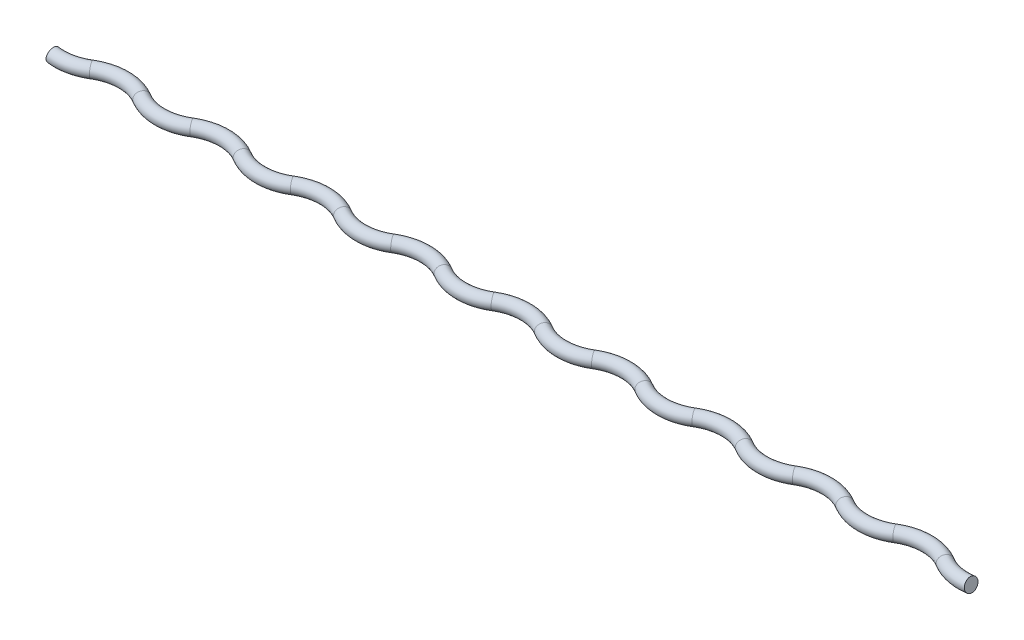
ISO-10303-21;
HEADER;
FILE_DESCRIPTION(('STEP AP214'),'2;1');
FILE_NAME('part.step','',(''),(''),'','','');
FILE_SCHEMA(('AUTOMOTIVE_DESIGN { 1 0 10303 214 1 1 1 1 }'));
ENDSEC;
DATA;
#1=APPLICATION_CONTEXT('core data for automotive mechanical design processes');
#2=APPLICATION_PROTOCOL_DEFINITION('international standard','automotive_design',2000,#1);
#3=PRODUCT_CONTEXT('',#1,'mechanical');
#4=PRODUCT('Part','Part','',(#3));
#5=PRODUCT_RELATED_PRODUCT_CATEGORY('part','',(#4));
#6=PRODUCT_DEFINITION_FORMATION('','',#4);
#7=PRODUCT_DEFINITION_CONTEXT('part definition',#1,'design');
#8=PRODUCT_DEFINITION('design','',#6,#7);
#9=PRODUCT_DEFINITION_SHAPE('','',#8);
#10=(LENGTH_UNIT() NAMED_UNIT(*) SI_UNIT(.MILLI.,.METRE.));
#11=(NAMED_UNIT(*) PLANE_ANGLE_UNIT() SI_UNIT($,.RADIAN.));
#12=(NAMED_UNIT(*) SI_UNIT($,.STERADIAN.) SOLID_ANGLE_UNIT());
#13=UNCERTAINTY_MEASURE_WITH_UNIT(LENGTH_MEASURE(1.E-05),#10,'distance_accuracy_value','');
#14=(GEOMETRIC_REPRESENTATION_CONTEXT(3) GLOBAL_UNCERTAINTY_ASSIGNED_CONTEXT((#13)) GLOBAL_UNIT_ASSIGNED_CONTEXT((#10,
#11,#12)) REPRESENTATION_CONTEXT('',''));
#15=CARTESIAN_POINT('',(0.,0.,0.));
#16=DIRECTION('',(0.,0.,1.));
#17=DIRECTION('',(1.,0.,0.));
#18=AXIS2_PLACEMENT_3D('',#15,#16,#17);
#19=CARTESIAN_POINT('',(0.,0.,29.778888860546));
#20=DIRECTION('',(0.,0.,-1.));
#21=DIRECTION('',(-1.,0.,0.));
#22=AXIS2_PLACEMENT_3D('',#19,#20,#21);
#23=CYLINDRICAL_SURFACE('',#22,6.9);
#24=CARTESIAN_POINT('',(-6.861066734108,0.731958516664,0.551673406014));
#25=CARTESIAN_POINT('',(-6.861647917028,0.726510756017,0.552583724596));
#26=CARTESIAN_POINT('',(-6.862206206041,0.721216169601,0.553941376582));
#27=CARTESIAN_POINT('',(-6.863280247994,0.710922650518,0.557519617921));
#28=CARTESIAN_POINT('',(-6.863795993767,0.705923697934,0.559740152154));
#29=CARTESIAN_POINT('',(-6.864785543563,0.696234985269,0.565083777531));
#30=CARTESIAN_POINT('',(-6.865245082189,0.691685160617,0.568129724994));
#31=CARTESIAN_POINT('',(-6.866099773349,0.683148814216,0.574936352947));
#32=CARTESIAN_POINT('',(-6.866494908518,0.679162315691,0.578697064755));
#33=CARTESIAN_POINT('',(-6.867221874932,0.671771921038,0.586961668663));
#34=CARTESIAN_POINT('',(-6.867543389303,0.668473191246,0.59134851969));
#35=CARTESIAN_POINT('',(-6.868109496233,0.662631541,0.600604225865));
#36=CARTESIAN_POINT('',(-6.868354065815,0.660088708046,0.605473137678));
#37=CARTESIAN_POINT('',(-6.868769498121,0.655751780074,0.615784396645));
#38=CARTESIAN_POINT('',(-6.868933396042,0.65403031842,0.621088704832));
#39=CARTESIAN_POINT('',(-6.869176918725,0.651467662999,0.631907940249));
#40=CARTESIAN_POINT('',(-6.869256524696,0.650626581189,0.637422894449));
#41=CARTESIAN_POINT('',(-6.869330270421,0.649847514319,0.648777518252));
#42=CARTESIAN_POINT('',(-6.869321734534,0.649937854185,0.654460624658));
#43=CARTESIAN_POINT('',(-6.869217301147,0.651040687253,0.665735951735));
#44=CARTESIAN_POINT('',(-6.869121399028,0.652053257394,0.671328164849));
#45=CARTESIAN_POINT('',(-6.868835581417,0.655057297939,0.682495482437));
#46=CARTESIAN_POINT('',(-6.868648451173,0.657019199895,0.68790973424));
#47=CARTESIAN_POINT('',(-6.868189141701,0.661803361016,0.698339861372));
#48=CARTESIAN_POINT('',(-6.867916974648,0.664625633242,0.703355731248));
#49=CARTESIAN_POINT('',(-6.86727905821,0.67118495934,0.712995847321));
#50=CARTESIAN_POINT('',(-6.86692201009,0.674831976241,0.717478969508));
#51=CARTESIAN_POINT('',(-6.866132787576,0.682815225514,0.725774687425));
#52=CARTESIAN_POINT('',(-6.865700634754,0.687151425751,0.729587316142));
#53=CARTESIAN_POINT('',(-6.864755344841,0.696531555511,0.736499208198));
#54=CARTESIAN_POINT('',(-6.864256143939,0.701437152703,0.739500230792));
#55=CARTESIAN_POINT('',(-6.8632020994,0.711676493628,0.744637112543));
#56=CARTESIAN_POINT('',(-6.862647274256,0.717010200682,0.746773048637));
#57=CARTESIAN_POINT('',(-6.861481674352,0.728079624993,0.750121839693));
#58=CARTESIAN_POINT('',(-6.860888374974,0.733650290574,0.751293533665));
#59=CARTESIAN_POINT('',(-6.859675395439,0.744906377951,0.752682766346));
#60=CARTESIAN_POINT('',(-6.85905572084,0.750591788529,0.752900400932));
#61=CARTESIAN_POINT('',(-6.85779560467,0.762018444841,0.752336069034));
#62=CARTESIAN_POINT('',(-6.857173848979,0.767591755806,0.751573441735));
#63=CARTESIAN_POINT('',(-6.855940440293,0.778531295366,0.74912028844));
#64=CARTESIAN_POINT('',(-6.855328778127,0.783897539994,0.747429838492));
#65=CARTESIAN_POINT('',(-6.854125063645,0.794353189118,0.74309952695));
#66=CARTESIAN_POINT('',(-6.853550399049,0.799292965267,0.740533517457));
#67=CARTESIAN_POINT('',(-6.852449511628,0.808676701297,0.734607515869));
#68=CARTESIAN_POINT('',(-6.851923272131,0.813120676199,0.731247550645));
#69=CARTESIAN_POINT('',(-6.850929050733,0.821455176748,0.723728273473));
#70=CARTESIAN_POINT('',(-6.850475022563,0.825229543083,0.719684469814));
#71=CARTESIAN_POINT('',(-6.849648783256,0.832059721152,0.711022416772));
#72=CARTESIAN_POINT('',(-6.84927655969,0.835115506406,0.706404147691));
#73=CARTESIAN_POINT('',(-6.848621034528,0.840474389223,0.696578474819));
#74=CARTESIAN_POINT('',(-6.84834697844,0.84270217194,0.691512780717));
#75=CARTESIAN_POINT('',(-6.847903139692,0.846301292153,0.681081291112));
#76=CARTESIAN_POINT('',(-6.84773335742,0.847672542883,0.675715465639));
#77=CARTESIAN_POINT('',(-6.847502511501,0.849535309639,0.66463196408));
#78=CARTESIAN_POINT('',(-6.847445533312,0.849993922568,0.659069013419));
#79=CARTESIAN_POINT('',(-6.847444039274,0.850005958269,0.647941875843));
#80=CARTESIAN_POINT('',(-6.847499537091,0.849559260774,0.642377688764));
#81=CARTESIAN_POINT('',(-6.847727903307,0.847716602485,0.631157432546));
#82=CARTESIAN_POINT('',(-6.847899415271,0.846331470087,0.625659452113));
#83=CARTESIAN_POINT('',(-6.848348041267,0.842693576932,0.614962764682));
#84=CARTESIAN_POINT('',(-6.84862517553,0.840440725828,0.609764089232));
#85=CARTESIAN_POINT('',(-6.84929252621,0.834984784054,0.599578298581));
#86=CARTESIAN_POINT('',(-6.849675331775,0.831841562128,0.594741472594));
#87=CARTESIAN_POINT('',(-6.850525388209,0.824811760773,0.585650467813));
#88=CARTESIAN_POINT('',(-6.850992656978,0.820925176351,0.581396294553));
#89=CARTESIAN_POINT('',(-6.852017814071,0.81232435543,0.573447890826));
#90=CARTESIAN_POINT('',(-6.852561919478,0.807724652831,0.569875545786));
#91=CARTESIAN_POINT('',(-6.853701385437,0.797998304718,0.563550838972));
#92=CARTESIAN_POINT('',(-6.854296756631,0.79287172223,0.560798382144));
#93=CARTESIAN_POINT('',(-6.855535382726,0.782089455512,0.556169982251));
#94=CARTESIAN_POINT('',(-6.856160150322,0.776595027906,0.55435792185));
#95=CARTESIAN_POINT('',(-6.857421232735,0.765379566661,0.551695559163));
#96=CARTESIAN_POINT('',(-6.858057551631,0.759658574767,0.550845082647));
#97=CARTESIAN_POINT('',(-6.859102247391,0.750153282753,0.550290937483));
#98=CARTESIAN_POINT('',(-6.859500829024,0.746499701917,0.550282367222));
#99=CARTESIAN_POINT('',(-6.860289865652,0.739213357285,0.550670985734));
#100=CARTESIAN_POINT('',(-6.86068032053,0.735580592625,0.551068158598));
#101=CARTESIAN_POINT('',(-6.861066734108,0.731958516664,0.551673406014));
#102=(BOUNDED_CURVE() B_SPLINE_CURVE(3,(#24,#25,#26,#27,#28,#29,#30,#31,#32,#33,#34,#35,#36,#37,
#38,#39,#40,#41,#42,#43,#44,#45,#46,#47,#48,#49,#50,#51,#52,#53,#54,#55,#56,#57,#58,#59,#60,#61,
#62,#63,#64,#65,#66,#67,#68,#69,#70,#71,#72,#73,#74,#75,#76,#77,#78,#79,#80,#81,#82,#83,#84,#85,
#86,#87,#88,#89,#90,#91,#92,#93,#94,#95,#96,#97,#98,#99,#100,#101),.UNSPECIFIED.,.T.,
.F.) B_SPLINE_CURVE_WITH_KNOTS((4,2,2,2,2,2,2,2,2,2,2,2,2,2,2,2,2,2,2,2,2,2,2,2,2,2,2,2,2,2,2,2,
2,2,2,2,2,2,4),(0.,0.01642578149364,0.03285156298728,0.04927819433326,0.06570482567923,
0.08213960966108,0.09857439364293,0.115252530148,0.131930666654,0.148925831361,0.165920996067,
0.1831531784,0.200385360734,0.217705013623,0.235024666513,0.252291542667,0.26955841882,
0.28667793049,0.30379744216,0.320724023683,0.337650605205,0.354385049828,0.371119494451,
0.387714073446,0.40430865244,0.420872912787,0.437437173133,0.454124735561,0.470812297989,
0.487771565946,0.504730833903,0.522019590374,0.539308346845,0.556806515515,0.574304684185,
0.591715233509,0.609125782833,0.620047173094,0.630968563355),
.UNSPECIFIED.) CURVE() GEOMETRIC_REPRESENTATION_ITEM() RATIONAL_B_SPLINE_CURVE((1.,1.,1.,1.,1.,
1.,1.,1.,1.,1.,1.,1.,1.,1.,1.,1.,1.,1.,1.,1.,1.,1.,1.,1.,1.,1.,1.,1.,1.,1.,1.,1.,1.,1.,1.,1.,1.,
1.,1.,1.,1.,1.,1.,1.,1.,1.,1.,1.,1.,1.,1.,1.,1.,1.,1.,1.,1.,1.,1.,1.,1.,1.,1.,1.,1.,1.,1.,1.,1.,
1.,1.,1.,1.,1.,1.,1.,1.,1.)) REPRESENTATION_ITEM(''));
#103=CARTESIAN_POINT('',(-6.861066734108,0.731958516664,0.551673406014));
#104=VERTEX_POINT('',#103);
#105=EDGE_CURVE('E234',#104,#104,#102,.T.);
#106=ORIENTED_EDGE('',*,*,#105,.T.);
#107=EDGE_LOOP('',(#106));
#108=FACE_BOUND('',#107,.T.);
#109=ADVANCED_FACE('F17',(#108),#23,.T.);
#110=CARTESIAN_POINT('',(0.,0.,29.778888860546));
#111=DIRECTION('',(0.,0.,-1.));
#112=DIRECTION('',(-1.,0.,0.));
#113=AXIS2_PLACEMENT_3D('',#110,#111,#112);
#114=CYLINDRICAL_SURFACE('',#113,6.9);
#115=CARTESIAN_POINT('',(6.861066734108,0.731958516664,0.551673406014));
#116=CARTESIAN_POINT('',(6.860471069137,0.737542025869,0.550740403903));
#117=CARTESIAN_POINT('',(6.859868899691,0.743121891426,0.550304532315));
#118=CARTESIAN_POINT('',(6.858651560031,0.754274647962,0.550374209384));
#119=CARTESIAN_POINT('',(6.858036389714,0.759847538081,0.550879901817));
#120=CARTESIAN_POINT('',(6.85679389506,0.770979120922,0.552860545468));
#121=CARTESIAN_POINT('',(6.856184237104,0.776379806572,0.55430602518));
#122=CARTESIAN_POINT('',(6.854987604711,0.786875362702,0.55806012224));
#123=CARTESIAN_POINT('',(6.854400625323,0.791970185333,0.560368871924));
#124=CARTESIAN_POINT('',(6.853241598365,0.801938430694,0.565928300166));
#125=CARTESIAN_POINT('',(6.852686357148,0.806665770826,0.569117640083));
#126=CARTESIAN_POINT('',(6.851635596953,0.815542532202,0.576226947124));
#127=CARTESIAN_POINT('',(6.851140066258,0.819691907197,0.58014697028));
#128=CARTESIAN_POINT('',(6.850205887254,0.827462932981,0.588827806254));
#129=CARTESIAN_POINT('',(6.849781886072,0.83096198654,0.593478738175));
#130=CARTESIAN_POINT('',(6.84902856394,0.837148397942,0.603299057003));
#131=CARTESIAN_POINT('',(6.848699222154,0.839835790482,0.608468420463));
#132=CARTESIAN_POINT('',(6.84814280997,0.844360856896,0.619358018219));
#133=CARTESIAN_POINT('',(6.847924010168,0.846131462726,0.624920023987));
#134=CARTESIAN_POINT('',(6.847603635276,0.848720304573,0.636264397105));
#135=CARTESIAN_POINT('',(6.847502037358,0.849538668629,0.642046734629));
#136=CARTESIAN_POINT('',(6.847424278343,0.850165190141,0.653757492208));
#137=CARTESIAN_POINT('',(6.847447470769,0.849978580406,0.659510242878));
#138=CARTESIAN_POINT('',(6.847612982336,0.848644151705,0.670901152476));
#139=CARTESIAN_POINT('',(6.847755290197,0.847496468794,0.676539327543));
#140=CARTESIAN_POINT('',(6.848159970893,0.844220162951,0.687584825448));
#141=CARTESIAN_POINT('',(6.8484139942,0.842159145607,0.692832622565));
#142=CARTESIAN_POINT('',(6.849023059738,0.837191369794,0.702904835603));
#143=CARTESIAN_POINT('',(6.849378107435,0.83428468224,0.707729286182));
#144=CARTESIAN_POINT('',(6.850185096268,0.827632292251,0.716868036319));
#145=CARTESIAN_POINT('',(6.850623846832,0.823995628332,0.721056101067));
#146=CARTESIAN_POINT('',(6.85157123077,0.816080606307,0.728764782833));
#147=CARTESIAN_POINT('',(6.85207987956,0.81180225443,0.732285404356));
#148=CARTESIAN_POINT('',(6.853164126792,0.802597549463,0.738615843061));
#149=CARTESIAN_POINT('',(6.853723807772,0.797806441414,0.741338022636));
#150=CARTESIAN_POINT('',(6.854876297642,0.787842684297,0.745950061961));
#151=CARTESIAN_POINT('',(6.855469120603,0.782670016475,0.747839877693));
#152=CARTESIAN_POINT('',(6.856689434786,0.77190637353,0.750760723469));
#153=CARTESIAN_POINT('',(6.85729963676,0.766467304921,0.751746665133));
#154=CARTESIAN_POINT('',(6.858516559959,0.755500519252,0.752807933139));
#155=CARTESIAN_POINT('',(6.859123284995,0.749972794998,0.752883180904));
#156=CARTESIAN_POINT('',(6.860338675541,0.738772823373,0.752085511118));
#157=CARTESIAN_POINT('',(6.860930028439,0.733258962196,0.751215089619));
#158=CARTESIAN_POINT('',(6.862077077842,0.722445664766,0.748578654761));
#159=CARTESIAN_POINT('',(6.86263276487,0.717146247832,0.746812557979));
#160=CARTESIAN_POINT('',(6.863715325338,0.706710525173,0.742325964691));
#161=CARTESIAN_POINT('',(6.864226426469,0.701725172544,0.739658676344));
#162=CARTESIAN_POINT('',(6.865187943557,0.692255120068,0.733539525138));
#163=CARTESIAN_POINT('',(6.865638340531,0.687770456243,0.730087603532));
#164=CARTESIAN_POINT('',(6.866484005678,0.679275947811,0.722327418993));
#165=CARTESIAN_POINT('',(6.866866605782,0.675392833376,0.718121110174));
#166=CARTESIAN_POINT('',(6.867554066669,0.668366368365,0.709124695226));
#167=CARTESIAN_POINT('',(6.867858908351,0.665223039198,0.704334570911));
#168=CARTESIAN_POINT('',(6.868392949771,0.659686350412,0.69410777238));
#169=CARTESIAN_POINT('',(6.86861393279,0.657378218285,0.68881324822));
#170=CARTESIAN_POINT('',(6.868968361655,0.653664383439,0.67791390036));
#171=CARTESIAN_POINT('',(6.869101799839,0.65225864714,0.672309087852));
#172=CARTESIAN_POINT('',(6.869278968912,0.650390136232,0.660765822077));
#173=CARTESIAN_POINT('',(6.869320006473,0.649955883907,0.654993966915));
#174=CARTESIAN_POINT('',(6.869310994652,0.650051121913,0.643458453665));
#175=CARTESIAN_POINT('',(6.869260956463,0.650580506682,0.637694794679));
#176=CARTESIAN_POINT('',(6.869065039094,0.652645812819,0.626217075304));
#177=CARTESIAN_POINT('',(6.868922686476,0.654144458578,0.620670819424));
#178=CARTESIAN_POINT('',(6.868549762179,0.658048637985,0.609910705477));
#179=CARTESIAN_POINT('',(6.86831921629,0.660454039613,0.604696798572));
#180=CARTESIAN_POINT('',(6.867766566228,0.666176043514,0.594700461405));
#181=CARTESIAN_POINT('',(6.867454061655,0.669393515004,0.590059580325));
#182=CARTESIAN_POINT('',(6.866751639204,0.676561078069,0.581390096409));
#183=CARTESIAN_POINT('',(6.866361746667,0.680511094083,0.577361429015));
#184=CARTESIAN_POINT('',(6.865505147614,0.689098925154,0.570020464184));
#185=CARTESIAN_POINT('',(6.865052540755,0.693596604293,0.566803338246));
#186=CARTESIAN_POINT('',(6.8640894899,0.70306337656,0.561171462912));
#187=CARTESIAN_POINT('',(6.863579059817,0.708032470671,0.558756712788));
#188=CARTESIAN_POINT('',(6.862721711133,0.716282084044,0.555599265371));
#189=CARTESIAN_POINT('',(6.862399898943,0.719359062121,0.554596079849));
#190=CARTESIAN_POINT('',(6.861743218375,0.725596195107,0.55290068775));
#191=CARTESIAN_POINT('',(6.861408350383,0.728756351507,0.552208486506));
#192=CARTESIAN_POINT('',(6.861066734108,0.731958516664,0.551673406014));
#193=(BOUNDED_CURVE() B_SPLINE_CURVE(3,(#115,#116,#117,#118,#119,#120,#121,#122,#123,#124,#125,
#126,#127,#128,#129,#130,#131,#132,#133,#134,#135,#136,#137,#138,#139,#140,#141,#142,#143,#144,
#145,#146,#147,#148,#149,#150,#151,#152,#153,#154,#155,#156,#157,#158,#159,#160,#161,#162,#163,
#164,#165,#166,#167,#168,#169,#170,#171,#172,#173,#174,#175,#176,#177,#178,#179,#180,#181,#182,
#183,#184,#185,#186,#187,#188,#189,#190,#191,#192),.UNSPECIFIED.,.T.,
.F.) B_SPLINE_CURVE_WITH_KNOTS((4,2,2,2,2,2,2,2,2,2,2,2,2,2,2,2,2,2,2,2,2,2,2,2,2,2,2,2,2,2,2,2,
2,2,2,2,2,2,4),(0.,0.01682881908812,0.03365763817624,0.05046513141056,0.06727262464488,
0.08439863161922,0.101524638594,0.118974053753,0.136423468913,0.153892868785,0.171362268658,
0.188575137479,0.205788006301,0.222661296672,0.239534587042,0.256165156459,0.272795725875,
0.289348644588,0.3059015633,0.322521304498,0.339141045697,0.355917530555,0.372694015414,
0.389662845368,0.406631675322,0.423783133396,0.440934591469,0.458215689179,0.475496786889,
0.492804741559,0.510112696229,0.527297515286,0.544482334343,0.561392563542,0.578302792741,
0.594887135616,0.611471478491,0.621121960601,0.630772442711),
.UNSPECIFIED.) CURVE() GEOMETRIC_REPRESENTATION_ITEM() RATIONAL_B_SPLINE_CURVE((1.,1.,1.,1.,1.,
1.,1.,1.,1.,1.,1.,1.,1.,1.,1.,1.,1.,1.,1.,1.,1.,1.,1.,1.,1.,1.,1.,1.,1.,1.,1.,1.,1.,1.,1.,1.,1.,
1.,1.,1.,1.,1.,1.,1.,1.,1.,1.,1.,1.,1.,1.,1.,1.,1.,1.,1.,1.,1.,1.,1.,1.,1.,1.,1.,1.,1.,1.,1.,1.,
1.,1.,1.,1.,1.,1.,1.,1.,1.)) REPRESENTATION_ITEM(''));
#194=CARTESIAN_POINT('',(6.861066734108,0.731958516664,0.551673406014));
#195=VERTEX_POINT('',#194);
#196=EDGE_CURVE('E28',#195,#195,#193,.T.);
#197=ORIENTED_EDGE('',*,*,#196,.T.);
#198=EDGE_LOOP('',(#197));
#199=FACE_BOUND('',#198,.T.);
#200=ADVANCED_FACE('F19',(#199),#114,.T.);
#201=CARTESIAN_POINT('',(6.75,0.75,-0.06214285714286));
#202=DIRECTION('',(0.,1.,0.));
#203=DIRECTION('',(0.,0.,1.));
#204=AXIS2_PLACEMENT_3D('',#201,#202,#203);
#205=TOROIDAL_SURFACE('',#204,0.722142857143,0.1);
#206=ORIENTED_EDGE('',*,*,#196,.F.);
#207=CARTESIAN_POINT('',(6.426076663719,0.731958516664,0.47094240485));
#208=CARTESIAN_POINT('',(6.522701718224,0.731958516664,0.529655545609));
#209=CARTESIAN_POINT('',(6.633599938616,0.731958516664,0.565037162489));
#210=CARTESIAN_POINT('',(6.749808678198,0.731958516664,0.571804949694));
#211=CARTESIAN_POINT('',(6.861066734108,0.731958516664,0.551673406014));
#212=(BOUNDED_CURVE() B_SPLINE_CURVE(4,(#207,#208,#209,#210,#211),.UNSPECIFIED.,.F.,
.F.) B_SPLINE_CURVE_WITH_KNOTS((5,5),(-0.546017406173,0.179007736287),
.UNSPECIFIED.) CURVE() GEOMETRIC_REPRESENTATION_ITEM() RATIONAL_B_SPLINE_CURVE((1.,1.,1.,1.,1.)) REPRESENTATION_ITEM(''));
#213=CARTESIAN_POINT('',(6.426076663719,0.731958516664,0.47094240485));
#214=VERTEX_POINT('',#213);
#215=EDGE_CURVE('E11',#214,#195,#212,.T.);
#216=ORIENTED_EDGE('',*,*,#215,.F.);
#217=CARTESIAN_POINT('',(6.375,0.75,0.555));
#218=DIRECTION('',(0.854599406528091,0.,0.519287833828056));
#219=DIRECTION('',(0.519287833828056,0.,-0.854599406528091));
#220=AXIS2_PLACEMENT_3D('',#217,#218,#219);
#221=CIRCLE('',#220,0.1);
#222=CARTESIAN_POINT('',(6.426928783383,0.75,0.469540059347));
#223=VERTEX_POINT('',#222);
#224=EDGE_CURVE('E152',#214,#223,#221,.T.);
#225=ORIENTED_EDGE('',*,*,#224,.T.);
#226=CARTESIAN_POINT('',(6.375,0.75,0.555));
#227=DIRECTION('',(0.854599406528091,0.,0.519287833828056));
#228=DIRECTION('',(0.519287833828056,0.,-0.854599406528091));
#229=AXIS2_PLACEMENT_3D('',#226,#227,#228);
#230=CIRCLE('',#229,0.1);
#231=EDGE_CURVE('E159',#223,#214,#230,.T.);
#232=ORIENTED_EDGE('',*,*,#231,.T.);
#233=ORIENTED_EDGE('',*,*,#215,.T.);
#234=EDGE_LOOP('',(#206,#216,#225,#232,#233));
#235=FACE_BOUND('',#234,.T.);
#236=ADVANCED_FACE('F474',(#235),#205,.T.);
#237=CARTESIAN_POINT('',(6.,0.75,1.172142857143));
#238=DIRECTION('',(0.,-1.,0.));
#239=DIRECTION('',(0.,0.,-1.));
#240=AXIS2_PLACEMENT_3D('',#237,#238,#239);
#241=TOROIDAL_SURFACE('',#240,0.722142857143,0.1);
#242=CARTESIAN_POINT('',(5.625,0.75,0.555));
#243=DIRECTION('',(0.854599406528091,0.,-0.519287833828056));
#244=DIRECTION('',(-0.519287833828056,0.,-0.854599406528091));
#245=AXIS2_PLACEMENT_3D('',#242,#243,#244);
#246=CIRCLE('',#245,0.1);
#247=CARTESIAN_POINT('',(5.573071216617,0.75,0.469540059347));
#248=VERTEX_POINT('',#247);
#249=EDGE_CURVE('E161',#248,#248,#246,.T.);
#250=ORIENTED_EDGE('',*,*,#249,.T.);
#251=CARTESIAN_POINT('',(5.573071216617,0.75,0.469540059347));
#252=CARTESIAN_POINT('',(5.726524559506,0.75,0.376295840578));
#253=CARTESIAN_POINT('',(5.905431518956,0.75,0.32490242308));
#254=CARTESIAN_POINT('',(6.094568481044,0.75,0.32490242308));
#255=CARTESIAN_POINT('',(6.273475440494,0.75,0.376295840578));
#256=CARTESIAN_POINT('',(6.426928783383,0.75,0.469540059347));
#257=(BOUNDED_CURVE() B_SPLINE_CURVE(5,(#251,#252,#253,#254,#255,#256),.UNSPECIFIED.,.F.,
.F.) B_SPLINE_CURVE_WITH_KNOTS((6,6),(5.737167901006,6.829202713353),
.UNSPECIFIED.) CURVE() GEOMETRIC_REPRESENTATION_ITEM() RATIONAL_B_SPLINE_CURVE((1.,1.,1.,1.,1.,1.)) REPRESENTATION_ITEM(''));
#258=EDGE_CURVE('E160',#248,#223,#257,.T.);
#259=ORIENTED_EDGE('',*,*,#258,.T.);
#260=ORIENTED_EDGE('',*,*,#224,.F.);
#261=ORIENTED_EDGE('',*,*,#231,.F.);
#262=ORIENTED_EDGE('',*,*,#258,.F.);
#263=EDGE_LOOP('',(#250,#259,#260,#261,#262));
#264=FACE_BOUND('',#263,.T.);
#265=ADVANCED_FACE('F494',(#264),#241,.T.);
#266=CARTESIAN_POINT('',(5.25,0.75,-0.06214285714286));
#267=DIRECTION('',(0.,1.,0.));
#268=DIRECTION('',(0.,0.,1.));
#269=AXIS2_PLACEMENT_3D('',#266,#267,#268);
#270=TOROIDAL_SURFACE('',#269,0.722142857143,0.1);
#271=CARTESIAN_POINT('',(4.875,0.75,0.555));
#272=DIRECTION('',(0.854599406528091,0.,0.519287833828056));
#273=DIRECTION('',(0.519287833828056,0.,-0.854599406528091));
#274=AXIS2_PLACEMENT_3D('',#271,#272,#273);
#275=CIRCLE('',#274,0.1);
#276=CARTESIAN_POINT('',(4.926928783383,0.75,0.469540059347));
#277=VERTEX_POINT('',#276);
#278=EDGE_CURVE('E138',#277,#277,#275,.T.);
#279=ORIENTED_EDGE('',*,*,#278,.T.);
#280=CARTESIAN_POINT('',(4.926928783383,0.75,0.469540059347));
#281=CARTESIAN_POINT('',(5.04305203417,0.75,0.54010106243));
#282=CARTESIAN_POINT('',(5.178436883589,0.75,0.578992171588));
#283=CARTESIAN_POINT('',(5.321563116411,0.75,0.578992171588));
#284=CARTESIAN_POINT('',(5.45694796583,0.75,0.54010106243));
#285=CARTESIAN_POINT('',(5.573071216617,0.75,0.469540059347));
#286=(BOUNDED_CURVE() B_SPLINE_CURVE(5,(#280,#281,#282,#283,#284,#285),.UNSPECIFIED.,.F.,
.F.) B_SPLINE_CURVE_WITH_KNOTS((6,6),(5.737167901006,6.829202713353),
.UNSPECIFIED.) CURVE() GEOMETRIC_REPRESENTATION_ITEM() RATIONAL_B_SPLINE_CURVE((1.,1.,1.,1.,1.,1.)) REPRESENTATION_ITEM(''));
#287=EDGE_CURVE('E142',#277,#248,#286,.T.);
#288=ORIENTED_EDGE('',*,*,#287,.T.);
#289=ORIENTED_EDGE('',*,*,#249,.F.);
#290=ORIENTED_EDGE('',*,*,#287,.F.);
#291=EDGE_LOOP('',(#279,#288,#289,#290));
#292=FACE_BOUND('',#291,.T.);
#293=ADVANCED_FACE('F491',(#292),#270,.T.);
#294=CARTESIAN_POINT('',(4.5,0.75,1.172142857143));
#295=DIRECTION('',(0.,-1.,0.));
#296=DIRECTION('',(0.,0.,-1.));
#297=AXIS2_PLACEMENT_3D('',#294,#295,#296);
#298=TOROIDAL_SURFACE('',#297,0.722142857143,0.1);
#299=CARTESIAN_POINT('',(4.125,0.75,0.555));
#300=DIRECTION('',(0.854599406528091,0.,-0.519287833828056));
#301=DIRECTION('',(-0.519287833828056,0.,-0.854599406528091));
#302=AXIS2_PLACEMENT_3D('',#299,#300,#301);
#303=CIRCLE('',#302,0.1);
#304=CARTESIAN_POINT('',(4.073071216617,0.75,0.469540059347));
#305=VERTEX_POINT('',#304);
#306=EDGE_CURVE('E170',#305,#305,#303,.T.);
#307=ORIENTED_EDGE('',*,*,#306,.T.);
#308=CARTESIAN_POINT('',(4.073071216617,0.75,0.469540059347));
#309=CARTESIAN_POINT('',(4.226524559506,0.75,0.376295840578));
#310=CARTESIAN_POINT('',(4.405431518956,0.75,0.32490242308));
#311=CARTESIAN_POINT('',(4.594568481044,0.75,0.32490242308));
#312=CARTESIAN_POINT('',(4.773475440494,0.75,0.376295840578));
#313=CARTESIAN_POINT('',(4.926928783383,0.75,0.469540059347));
#314=(BOUNDED_CURVE() B_SPLINE_CURVE(5,(#308,#309,#310,#311,#312,#313),.UNSPECIFIED.,.F.,
.F.) B_SPLINE_CURVE_WITH_KNOTS((6,6),(5.737167901006,6.829202713353),
.UNSPECIFIED.) CURVE() GEOMETRIC_REPRESENTATION_ITEM() RATIONAL_B_SPLINE_CURVE((1.,1.,1.,1.,1.,1.)) REPRESENTATION_ITEM(''));
#315=EDGE_CURVE('E143',#305,#277,#314,.T.);
#316=ORIENTED_EDGE('',*,*,#315,.T.);
#317=ORIENTED_EDGE('',*,*,#278,.F.);
#318=ORIENTED_EDGE('',*,*,#315,.F.);
#319=EDGE_LOOP('',(#307,#316,#317,#318));
#320=FACE_BOUND('',#319,.T.);
#321=ADVANCED_FACE('F493',(#320),#298,.T.);
#322=CARTESIAN_POINT('',(3.75,0.75,-0.06214285714286));
#323=DIRECTION('',(0.,1.,0.));
#324=DIRECTION('',(0.,0.,1.));
#325=AXIS2_PLACEMENT_3D('',#322,#323,#324);
#326=TOROIDAL_SURFACE('',#325,0.722142857143,0.1);
#327=CARTESIAN_POINT('',(3.375,0.75,0.555));
#328=DIRECTION('',(0.854599406528091,0.,0.519287833828056));
#329=DIRECTION('',(0.519287833828056,0.,-0.854599406528091));
#330=AXIS2_PLACEMENT_3D('',#327,#328,#329);
#331=CIRCLE('',#330,0.1);
#332=CARTESIAN_POINT('',(3.426928783383,0.75,0.469540059347));
#333=VERTEX_POINT('',#332);
#334=EDGE_CURVE('E297',#333,#333,#331,.T.);
#335=ORIENTED_EDGE('',*,*,#334,.T.);
#336=CARTESIAN_POINT('',(3.426928783383,0.75,0.469540059347));
#337=CARTESIAN_POINT('',(3.54305203417,0.75,0.54010106243));
#338=CARTESIAN_POINT('',(3.678436883589,0.75,0.578992171588));
#339=CARTESIAN_POINT('',(3.821563116411,0.75,0.578992171588));
#340=CARTESIAN_POINT('',(3.95694796583,0.75,0.54010106243));
#341=CARTESIAN_POINT('',(4.073071216617,0.75,0.469540059347));
#342=(BOUNDED_CURVE() B_SPLINE_CURVE(5,(#336,#337,#338,#339,#340,#341),.UNSPECIFIED.,.F.,
.F.) B_SPLINE_CURVE_WITH_KNOTS((6,6),(5.737167901006,6.829202713353),
.UNSPECIFIED.) CURVE() GEOMETRIC_REPRESENTATION_ITEM() RATIONAL_B_SPLINE_CURVE((1.,1.,1.,1.,1.,1.)) REPRESENTATION_ITEM(''));
#343=EDGE_CURVE('E200',#333,#305,#342,.T.);
#344=ORIENTED_EDGE('',*,*,#343,.T.);
#345=ORIENTED_EDGE('',*,*,#306,.F.);
#346=ORIENTED_EDGE('',*,*,#343,.F.);
#347=EDGE_LOOP('',(#335,#344,#345,#346));
#348=FACE_BOUND('',#347,.T.);
#349=ADVANCED_FACE('F478',(#348),#326,.T.);
#350=CARTESIAN_POINT('',(3.,0.75,1.172142857143));
#351=DIRECTION('',(0.,-1.,0.));
#352=DIRECTION('',(0.,0.,-1.));
#353=AXIS2_PLACEMENT_3D('',#350,#351,#352);
#354=TOROIDAL_SURFACE('',#353,0.722142857143,0.1);
#355=CARTESIAN_POINT('',(2.625,0.75,0.555));
#356=DIRECTION('',(0.854599406528091,0.,-0.519287833828056));
#357=DIRECTION('',(-0.519287833828056,0.,-0.854599406528091));
#358=AXIS2_PLACEMENT_3D('',#355,#356,#357);
#359=CIRCLE('',#358,0.1);
#360=CARTESIAN_POINT('',(2.573071216617,0.75,0.469540059347));
#361=VERTEX_POINT('',#360);
#362=EDGE_CURVE('E181',#361,#361,#359,.T.);
#363=ORIENTED_EDGE('',*,*,#362,.T.);
#364=CARTESIAN_POINT('',(2.573071216617,0.75,0.469540059347));
#365=CARTESIAN_POINT('',(2.726524559506,0.75,0.376295840578));
#366=CARTESIAN_POINT('',(2.905431518956,0.75,0.32490242308));
#367=CARTESIAN_POINT('',(3.094568481044,0.75,0.32490242308));
#368=CARTESIAN_POINT('',(3.273475440494,0.75,0.376295840578));
#369=CARTESIAN_POINT('',(3.426928783383,0.75,0.469540059347));
#370=(BOUNDED_CURVE() B_SPLINE_CURVE(5,(#364,#365,#366,#367,#368,#369),.UNSPECIFIED.,.F.,
.F.) B_SPLINE_CURVE_WITH_KNOTS((6,6),(5.737167901006,6.829202713353),
.UNSPECIFIED.) CURVE() GEOMETRIC_REPRESENTATION_ITEM() RATIONAL_B_SPLINE_CURVE((1.,1.,1.,1.,1.,1.)) REPRESENTATION_ITEM(''));
#371=EDGE_CURVE('E184',#361,#333,#370,.T.);
#372=ORIENTED_EDGE('',*,*,#371,.T.);
#373=ORIENTED_EDGE('',*,*,#334,.F.);
#374=ORIENTED_EDGE('',*,*,#371,.F.);
#375=EDGE_LOOP('',(#363,#372,#373,#374));
#376=FACE_BOUND('',#375,.T.);
#377=ADVANCED_FACE('F488',(#376),#354,.T.);
#378=CARTESIAN_POINT('',(2.25,0.75,-0.06214285714286));
#379=DIRECTION('',(0.,1.,0.));
#380=DIRECTION('',(0.,0.,1.));
#381=AXIS2_PLACEMENT_3D('',#378,#379,#380);
#382=TOROIDAL_SURFACE('',#381,0.722142857143,0.1);
#383=CARTESIAN_POINT('',(1.875,0.75,0.555));
#384=DIRECTION('',(0.854599406528091,0.,0.519287833828056));
#385=DIRECTION('',(0.519287833828056,0.,-0.854599406528091));
#386=AXIS2_PLACEMENT_3D('',#383,#384,#385);
#387=CIRCLE('',#386,0.1);
#388=CARTESIAN_POINT('',(1.926928783383,0.75,0.469540059347));
#389=VERTEX_POINT('',#388);
#390=EDGE_CURVE('E151',#389,#389,#387,.T.);
#391=ORIENTED_EDGE('',*,*,#390,.T.);
#392=CARTESIAN_POINT('',(1.926928783383,0.75,0.469540059347));
#393=CARTESIAN_POINT('',(2.04305203417,0.75,0.54010106243));
#394=CARTESIAN_POINT('',(2.178436883589,0.75,0.578992171588));
#395=CARTESIAN_POINT('',(2.321563116411,0.75,0.578992171588));
#396=CARTESIAN_POINT('',(2.45694796583,0.75,0.54010106243));
#397=CARTESIAN_POINT('',(2.573071216617,0.75,0.469540059347));
#398=(BOUNDED_CURVE() B_SPLINE_CURVE(5,(#392,#393,#394,#395,#396,#397),.UNSPECIFIED.,.F.,
.F.) B_SPLINE_CURVE_WITH_KNOTS((6,6),(5.737167901006,6.829202713353),
.UNSPECIFIED.) CURVE() GEOMETRIC_REPRESENTATION_ITEM() RATIONAL_B_SPLINE_CURVE((1.,1.,1.,1.,1.,1.)) REPRESENTATION_ITEM(''));
#399=EDGE_CURVE('E150',#389,#361,#398,.T.);
#400=ORIENTED_EDGE('',*,*,#399,.T.);
#401=ORIENTED_EDGE('',*,*,#362,.F.);
#402=ORIENTED_EDGE('',*,*,#399,.F.);
#403=EDGE_LOOP('',(#391,#400,#401,#402));
#404=FACE_BOUND('',#403,.T.);
#405=ADVANCED_FACE('F365',(#404),#382,.T.);
#406=CARTESIAN_POINT('',(1.5,0.75,1.172142857143));
#407=DIRECTION('',(0.,1.,0.));
#408=DIRECTION('',(0.,0.,1.));
#409=AXIS2_PLACEMENT_3D('',#406,#407,#408);
#410=TOROIDAL_SURFACE('',#409,0.722142857143,0.1);
#411=ORIENTED_EDGE('',*,*,#390,.F.);
#412=CARTESIAN_POINT('',(1.926928783383,0.75,0.469540059347));
#413=CARTESIAN_POINT('',(1.773475440494,0.75,0.376295840578));
#414=CARTESIAN_POINT('',(1.594568481044,0.75,0.32490242308));
#415=CARTESIAN_POINT('',(1.405431518956,0.75,0.32490242308));
#416=CARTESIAN_POINT('',(1.226524559506,0.75,0.376295840578));
#417=CARTESIAN_POINT('',(1.073071216617,0.75,0.469540059347));
#418=(BOUNDED_CURVE() B_SPLINE_CURVE(5,(#412,#413,#414,#415,#416,#417),.UNSPECIFIED.,.F.,
.F.) B_SPLINE_CURVE_WITH_KNOTS((6,6),(2.595575247416,3.687610059763),
.UNSPECIFIED.) CURVE() GEOMETRIC_REPRESENTATION_ITEM() RATIONAL_B_SPLINE_CURVE((1.,1.,1.,1.,1.,1.)) REPRESENTATION_ITEM(''));
#419=CARTESIAN_POINT('',(1.073071216617,0.75,0.469540059347));
#420=VERTEX_POINT('',#419);
#421=EDGE_CURVE('E144',#389,#420,#418,.T.);
#422=ORIENTED_EDGE('',*,*,#421,.T.);
#423=CARTESIAN_POINT('',(1.125,0.75,0.555));
#424=DIRECTION('',(0.854599406528091,0.,-0.519287833828056));
#425=DIRECTION('',(-0.519287833828056,0.,-0.854599406528091));
#426=AXIS2_PLACEMENT_3D('',#423,#424,#425);
#427=CIRCLE('',#426,0.1);
#428=EDGE_CURVE('E21',#420,#420,#427,.T.);
#429=ORIENTED_EDGE('',*,*,#428,.T.);
#430=ORIENTED_EDGE('',*,*,#421,.F.);
#431=EDGE_LOOP('',(#411,#422,#429,#430));
#432=FACE_BOUND('',#431,.T.);
#433=ADVANCED_FACE('F374',(#432),#410,.T.);
#434=CARTESIAN_POINT('',(0.75,0.75,-0.06214285714286));
#435=DIRECTION('',(0.,1.,0.));
#436=DIRECTION('',(0.,0.,1.));
#437=AXIS2_PLACEMENT_3D('',#434,#435,#436);
#438=TOROIDAL_SURFACE('',#437,0.722142857143,0.1);
#439=CARTESIAN_POINT('',(0.375,0.75,0.555));
#440=DIRECTION('',(0.854599406528091,0.,0.519287833828056));
#441=DIRECTION('',(0.519287833828056,0.,-0.854599406528091));
#442=AXIS2_PLACEMENT_3D('',#439,#440,#441);
#443=CIRCLE('',#442,0.1);
#444=CARTESIAN_POINT('',(0.426928783383,0.75,0.469540059347));
#445=VERTEX_POINT('',#444);
#446=EDGE_CURVE('E188',#445,#445,#443,.T.);
#447=ORIENTED_EDGE('',*,*,#446,.T.);
#448=CARTESIAN_POINT('',(0.426928783383,0.75,0.469540059347));
#449=CARTESIAN_POINT('',(0.54305203417,0.75,0.54010106243));
#450=CARTESIAN_POINT('',(0.678436883589,0.75,0.578992171588));
#451=CARTESIAN_POINT('',(0.821563116411,0.75,0.578992171588));
#452=CARTESIAN_POINT('',(0.95694796583,0.75,0.54010106243));
#453=CARTESIAN_POINT('',(1.073071216617,0.75,0.469540059347));
#454=(BOUNDED_CURVE() B_SPLINE_CURVE(5,(#448,#449,#450,#451,#452,#453),.UNSPECIFIED.,.F.,
.F.) B_SPLINE_CURVE_WITH_KNOTS((6,6),(5.737167901006,6.829202713353),
.UNSPECIFIED.) CURVE() GEOMETRIC_REPRESENTATION_ITEM() RATIONAL_B_SPLINE_CURVE((1.,1.,1.,1.,1.,1.)) REPRESENTATION_ITEM(''));
#455=EDGE_CURVE('E195',#445,#420,#454,.T.);
#456=ORIENTED_EDGE('',*,*,#455,.T.);
#457=ORIENTED_EDGE('',*,*,#428,.F.);
#458=ORIENTED_EDGE('',*,*,#455,.F.);
#459=EDGE_LOOP('',(#447,#456,#457,#458));
#460=FACE_BOUND('',#459,.T.);
#461=ADVANCED_FACE('F544',(#460),#438,.T.);
#462=CARTESIAN_POINT('',(0.,0.75,1.172142857143));
#463=DIRECTION('',(0.,-1.,0.));
#464=DIRECTION('',(0.,0.,-1.));
#465=AXIS2_PLACEMENT_3D('',#462,#463,#464);
#466=TOROIDAL_SURFACE('',#465,0.722142857143,0.1);
#467=CARTESIAN_POINT('',(-0.375,0.75,0.555));
#468=DIRECTION('',(0.854599406528091,0.,-0.519287833828056));
#469=DIRECTION('',(-0.519287833828056,0.,-0.854599406528091));
#470=AXIS2_PLACEMENT_3D('',#467,#468,#469);
#471=CIRCLE('',#470,0.1);
#472=CARTESIAN_POINT('',(-0.426928783383,0.75,0.469540059347));
#473=VERTEX_POINT('',#472);
#474=EDGE_CURVE('E215',#473,#473,#471,.T.);
#475=ORIENTED_EDGE('',*,*,#474,.T.);
#476=CARTESIAN_POINT('',(-0.426928783383,0.75,0.469540059347));
#477=CARTESIAN_POINT('',(-0.273475440494,0.75,0.376295840578));
#478=CARTESIAN_POINT('',(-0.09456848104354,0.75,0.32490242308));
#479=CARTESIAN_POINT('',(0.09456848104354,0.75,0.32490242308));
#480=CARTESIAN_POINT('',(0.273475440494,0.75,0.376295840578));
#481=CARTESIAN_POINT('',(0.426928783383,0.75,0.469540059347));
#482=(BOUNDED_CURVE() B_SPLINE_CURVE(5,(#476,#477,#478,#479,#480,#481),.UNSPECIFIED.,.F.,
.F.) B_SPLINE_CURVE_WITH_KNOTS((6,6),(5.737167901006,6.829202713353),
.UNSPECIFIED.) CURVE() GEOMETRIC_REPRESENTATION_ITEM() RATIONAL_B_SPLINE_CURVE((1.,1.,1.,1.,1.,1.)) REPRESENTATION_ITEM(''));
#483=EDGE_CURVE('E196',#473,#445,#482,.T.);
#484=ORIENTED_EDGE('',*,*,#483,.T.);
#485=ORIENTED_EDGE('',*,*,#446,.F.);
#486=ORIENTED_EDGE('',*,*,#483,.F.);
#487=EDGE_LOOP('',(#475,#484,#485,#486));
#488=FACE_BOUND('',#487,.T.);
#489=ADVANCED_FACE('F486',(#488),#466,.T.);
#490=CARTESIAN_POINT('',(-6.75,0.75,-0.06214285714286));
#491=DIRECTION('',(0.,1.,0.));
#492=DIRECTION('',(0.,0.,1.));
#493=AXIS2_PLACEMENT_3D('',#490,#491,#492);
#494=TOROIDAL_SURFACE('',#493,0.722142857143,0.1);
#495=ORIENTED_EDGE('',*,*,#105,.F.);
#496=CARTESIAN_POINT('',(-6.861066734108,0.731958516664,0.551673406014));
#497=CARTESIAN_POINT('',(-6.749808678198,0.731958516664,0.571804949694));
#498=CARTESIAN_POINT('',(-6.633599938616,0.731958516664,0.565037162489));
#499=CARTESIAN_POINT('',(-6.522701718224,0.731958516664,0.529655545609));
#500=CARTESIAN_POINT('',(-6.426076663719,0.731958516664,0.47094240485));
#501=(BOUNDED_CURVE() B_SPLINE_CURVE(4,(#496,#497,#498,#499,#500),.UNSPECIFIED.,.F.,
.F.) B_SPLINE_CURVE_WITH_KNOTS((5,5),(6.104177570893,6.829202713353),
.UNSPECIFIED.) CURVE() GEOMETRIC_REPRESENTATION_ITEM() RATIONAL_B_SPLINE_CURVE((1.,1.,1.,1.,1.)) REPRESENTATION_ITEM(''));
#502=CARTESIAN_POINT('',(-6.426076663719,0.731958516664,0.47094240485));
#503=VERTEX_POINT('',#502);
#504=EDGE_CURVE('E214',#104,#503,#501,.T.);
#505=ORIENTED_EDGE('',*,*,#504,.T.);
#506=CARTESIAN_POINT('',(-6.375,0.75,0.555));
#507=DIRECTION('',(0.854599406528091,0.,-0.519287833828056));
#508=DIRECTION('',(-0.519287833828056,0.,-0.854599406528091));
#509=AXIS2_PLACEMENT_3D('',#506,#507,#508);
#510=CIRCLE('',#509,0.1);
#511=CARTESIAN_POINT('',(-6.426928783383,0.75,0.469540059347));
#512=VERTEX_POINT('',#511);
#513=EDGE_CURVE('E235',#512,#503,#510,.T.);
#514=ORIENTED_EDGE('',*,*,#513,.F.);
#515=CARTESIAN_POINT('',(-6.375,0.75,0.555));
#516=DIRECTION('',(0.854599406528091,0.,-0.519287833828056));
#517=DIRECTION('',(-0.519287833828056,0.,-0.854599406528091));
#518=AXIS2_PLACEMENT_3D('',#515,#516,#517);
#519=CIRCLE('',#518,0.1);
#520=EDGE_CURVE('E228',#503,#512,#519,.T.);
#521=ORIENTED_EDGE('',*,*,#520,.F.);
#522=ORIENTED_EDGE('',*,*,#504,.F.);
#523=EDGE_LOOP('',(#495,#505,#514,#521,#522));
#524=FACE_BOUND('',#523,.T.);
#525=ADVANCED_FACE('F483',(#524),#494,.T.);
#526=CARTESIAN_POINT('',(-6.,0.75,1.172142857143));
#527=DIRECTION('',(0.,1.,0.));
#528=DIRECTION('',(0.,0.,1.));
#529=AXIS2_PLACEMENT_3D('',#526,#527,#528);
#530=TOROIDAL_SURFACE('',#529,0.722142857143,0.1);
#531=CARTESIAN_POINT('',(-5.625,0.75,0.555));
#532=DIRECTION('',(0.854599406528091,0.,0.519287833828056));
#533=DIRECTION('',(0.519287833828056,0.,-0.854599406528091));
#534=AXIS2_PLACEMENT_3D('',#531,#532,#533);
#535=CIRCLE('',#534,0.1);
#536=CARTESIAN_POINT('',(-5.573071216617,0.75,0.469540059347));
#537=VERTEX_POINT('',#536);
#538=EDGE_CURVE('E136',#537,#537,#535,.T.);
#539=ORIENTED_EDGE('',*,*,#538,.F.);
#540=CARTESIAN_POINT('',(-5.573071216617,0.75,0.469540059347));
#541=CARTESIAN_POINT('',(-5.726524559506,0.75,0.376295840578));
#542=CARTESIAN_POINT('',(-5.905431518956,0.75,0.32490242308));
#543=CARTESIAN_POINT('',(-6.094568481044,0.75,0.32490242308));
#544=CARTESIAN_POINT('',(-6.273475440494,0.75,0.376295840578));
#545=CARTESIAN_POINT('',(-6.426928783383,0.75,0.469540059347));
#546=(BOUNDED_CURVE() B_SPLINE_CURVE(5,(#540,#541,#542,#543,#544,#545),.UNSPECIFIED.,.F.,
.F.) B_SPLINE_CURVE_WITH_KNOTS((6,6),(2.595575247416,3.687610059763),
.UNSPECIFIED.) CURVE() GEOMETRIC_REPRESENTATION_ITEM() RATIONAL_B_SPLINE_CURVE((1.,1.,1.,1.,1.,1.)) REPRESENTATION_ITEM(''));
#547=EDGE_CURVE('E273',#537,#512,#546,.T.);
#548=ORIENTED_EDGE('',*,*,#547,.T.);
#549=ORIENTED_EDGE('',*,*,#513,.T.);
#550=ORIENTED_EDGE('',*,*,#520,.T.);
#551=ORIENTED_EDGE('',*,*,#547,.F.);
#552=EDGE_LOOP('',(#539,#548,#549,#550,#551));
#553=FACE_BOUND('',#552,.T.);
#554=ADVANCED_FACE('F445',(#553),#530,.T.);
#555=CARTESIAN_POINT('',(-5.25,0.75,-0.06214285714286));
#556=DIRECTION('',(0.,1.,0.));
#557=DIRECTION('',(0.,0.,1.));
#558=AXIS2_PLACEMENT_3D('',#555,#556,#557);
#559=TOROIDAL_SURFACE('',#558,0.722142857143,0.1);
#560=ORIENTED_EDGE('',*,*,#538,.T.);
#561=CARTESIAN_POINT('',(-5.573071216617,0.75,0.469540059347));
#562=CARTESIAN_POINT('',(-5.45694796583,0.75,0.54010106243));
#563=CARTESIAN_POINT('',(-5.321563116411,0.75,0.578992171588));
#564=CARTESIAN_POINT('',(-5.178436883589,0.75,0.578992171588));
#565=CARTESIAN_POINT('',(-5.04305203417,0.75,0.54010106243));
#566=CARTESIAN_POINT('',(-4.926928783383,0.75,0.469540059347));
#567=(BOUNDED_CURVE() B_SPLINE_CURVE(5,(#561,#562,#563,#564,#565,#566),.UNSPECIFIED.,.F.,
.F.) B_SPLINE_CURVE_WITH_KNOTS((6,6),(5.737167901006,6.829202713353),
.UNSPECIFIED.) CURVE() GEOMETRIC_REPRESENTATION_ITEM() RATIONAL_B_SPLINE_CURVE((1.,1.,1.,1.,1.,1.)) REPRESENTATION_ITEM(''));
#568=CARTESIAN_POINT('',(-4.926928783383,0.75,0.469540059347));
#569=VERTEX_POINT('',#568);
#570=EDGE_CURVE('E177',#537,#569,#567,.T.);
#571=ORIENTED_EDGE('',*,*,#570,.T.);
#572=CARTESIAN_POINT('',(-4.875,0.75,0.555));
#573=DIRECTION('',(0.854599406528091,0.,-0.519287833828056));
#574=DIRECTION('',(-0.519287833828056,0.,-0.854599406528091));
#575=AXIS2_PLACEMENT_3D('',#572,#573,#574);
#576=CIRCLE('',#575,0.1);
#577=EDGE_CURVE('E129',#569,#569,#576,.T.);
#578=ORIENTED_EDGE('',*,*,#577,.F.);
#579=ORIENTED_EDGE('',*,*,#570,.F.);
#580=EDGE_LOOP('',(#560,#571,#578,#579));
#581=FACE_BOUND('',#580,.T.);
#582=ADVANCED_FACE('F450',(#581),#559,.T.);
#583=CARTESIAN_POINT('',(-4.5,0.75,1.172142857143));
#584=DIRECTION('',(0.,1.,0.));
#585=DIRECTION('',(0.,0.,1.));
#586=AXIS2_PLACEMENT_3D('',#583,#584,#585);
#587=TOROIDAL_SURFACE('',#586,0.722142857143,0.1);
#588=CARTESIAN_POINT('',(-4.125,0.75,0.555));
#589=DIRECTION('',(0.854599406528091,0.,0.519287833828056));
#590=DIRECTION('',(0.519287833828056,0.,-0.854599406528091));
#591=AXIS2_PLACEMENT_3D('',#588,#589,#590);
#592=CIRCLE('',#591,0.1);
#593=CARTESIAN_POINT('',(-4.073071216617,0.75,0.469540059347));
#594=VERTEX_POINT('',#593);
#595=EDGE_CURVE('E258',#594,#594,#592,.T.);
#596=ORIENTED_EDGE('',*,*,#595,.F.);
#597=CARTESIAN_POINT('',(-4.073071216617,0.75,0.469540059347));
#598=CARTESIAN_POINT('',(-4.226524559506,0.75,0.376295840578));
#599=CARTESIAN_POINT('',(-4.405431518956,0.75,0.32490242308));
#600=CARTESIAN_POINT('',(-4.594568481044,0.75,0.32490242308));
#601=CARTESIAN_POINT('',(-4.773475440494,0.75,0.376295840578));
#602=CARTESIAN_POINT('',(-4.926928783383,0.75,0.469540059347));
#603=(BOUNDED_CURVE() B_SPLINE_CURVE(5,(#597,#598,#599,#600,#601,#602),.UNSPECIFIED.,.F.,
.F.) B_SPLINE_CURVE_WITH_KNOTS((6,6),(2.595575247416,3.687610059763),
.UNSPECIFIED.) CURVE() GEOMETRIC_REPRESENTATION_ITEM() RATIONAL_B_SPLINE_CURVE((1.,1.,1.,1.,1.,1.)) REPRESENTATION_ITEM(''));
#604=EDGE_CURVE('E137',#594,#569,#603,.T.);
#605=ORIENTED_EDGE('',*,*,#604,.T.);
#606=ORIENTED_EDGE('',*,*,#577,.T.);
#607=ORIENTED_EDGE('',*,*,#604,.F.);
#608=EDGE_LOOP('',(#596,#605,#606,#607));
#609=FACE_BOUND('',#608,.T.);
#610=ADVANCED_FACE('F453',(#609),#587,.T.);
#611=CARTESIAN_POINT('',(-3.75,0.75,-0.06214285714286));
#612=DIRECTION('',(0.,1.,0.));
#613=DIRECTION('',(0.,0.,1.));
#614=AXIS2_PLACEMENT_3D('',#611,#612,#613);
#615=TOROIDAL_SURFACE('',#614,0.722142857143,0.1);
#616=ORIENTED_EDGE('',*,*,#595,.T.);
#617=CARTESIAN_POINT('',(-4.073071216617,0.75,0.469540059347));
#618=CARTESIAN_POINT('',(-3.95694796583,0.75,0.54010106243));
#619=CARTESIAN_POINT('',(-3.821563116411,0.75,0.578992171588));
#620=CARTESIAN_POINT('',(-3.678436883589,0.75,0.578992171588));
#621=CARTESIAN_POINT('',(-3.54305203417,0.75,0.54010106243));
#622=CARTESIAN_POINT('',(-3.426928783383,0.75,0.469540059347));
#623=(BOUNDED_CURVE() B_SPLINE_CURVE(5,(#617,#618,#619,#620,#621,#622),.UNSPECIFIED.,.F.,
.F.) B_SPLINE_CURVE_WITH_KNOTS((6,6),(5.737167901006,6.829202713353),
.UNSPECIFIED.) CURVE() GEOMETRIC_REPRESENTATION_ITEM() RATIONAL_B_SPLINE_CURVE((1.,1.,1.,1.,1.,1.)) REPRESENTATION_ITEM(''));
#624=CARTESIAN_POINT('',(-3.426928783383,0.75,0.469540059347));
#625=VERTEX_POINT('',#624);
#626=EDGE_CURVE('E98',#594,#625,#623,.T.);
#627=ORIENTED_EDGE('',*,*,#626,.T.);
#628=CARTESIAN_POINT('',(-3.375,0.75,0.555));
#629=DIRECTION('',(0.854599406528091,0.,-0.519287833828056));
#630=DIRECTION('',(-0.519287833828056,0.,-0.854599406528091));
#631=AXIS2_PLACEMENT_3D('',#628,#629,#630);
#632=CIRCLE('',#631,0.1);
#633=EDGE_CURVE('E110',#625,#625,#632,.T.);
#634=ORIENTED_EDGE('',*,*,#633,.F.);
#635=ORIENTED_EDGE('',*,*,#626,.F.);
#636=EDGE_LOOP('',(#616,#627,#634,#635));
#637=FACE_BOUND('',#636,.T.);
#638=ADVANCED_FACE('F454',(#637),#615,.T.);
#639=CARTESIAN_POINT('',(-3.,0.75,1.172142857143));
#640=DIRECTION('',(0.,1.,0.));
#641=DIRECTION('',(0.,0.,1.));
#642=AXIS2_PLACEMENT_3D('',#639,#640,#641);
#643=TOROIDAL_SURFACE('',#642,0.722142857143,0.1);
#644=CARTESIAN_POINT('',(-2.625,0.75,0.555));
#645=DIRECTION('',(0.854599406528091,0.,0.519287833828056));
#646=DIRECTION('',(0.519287833828056,0.,-0.854599406528091));
#647=AXIS2_PLACEMENT_3D('',#644,#645,#646);
#648=CIRCLE('',#647,0.1);
#649=CARTESIAN_POINT('',(-2.573071216617,0.75,0.469540059347));
#650=VERTEX_POINT('',#649);
#651=EDGE_CURVE('E109',#650,#650,#648,.T.);
#652=ORIENTED_EDGE('',*,*,#651,.F.);
#653=CARTESIAN_POINT('',(-2.573071216617,0.75,0.469540059347));
#654=CARTESIAN_POINT('',(-2.726524559506,0.75,0.376295840578));
#655=CARTESIAN_POINT('',(-2.905431518956,0.75,0.32490242308));
#656=CARTESIAN_POINT('',(-3.094568481044,0.75,0.32490242308));
#657=CARTESIAN_POINT('',(-3.273475440494,0.75,0.376295840578));
#658=CARTESIAN_POINT('',(-3.426928783383,0.75,0.469540059347));
#659=(BOUNDED_CURVE() B_SPLINE_CURVE(5,(#653,#654,#655,#656,#657,#658),.UNSPECIFIED.,.F.,
.F.) B_SPLINE_CURVE_WITH_KNOTS((6,6),(2.595575247416,3.687610059763),
.UNSPECIFIED.) CURVE() GEOMETRIC_REPRESENTATION_ITEM() RATIONAL_B_SPLINE_CURVE((1.,1.,1.,1.,1.,1.)) REPRESENTATION_ITEM(''));
#660=EDGE_CURVE('E105',#650,#625,#659,.T.);
#661=ORIENTED_EDGE('',*,*,#660,.T.);
#662=ORIENTED_EDGE('',*,*,#633,.T.);
#663=ORIENTED_EDGE('',*,*,#660,.F.);
#664=EDGE_LOOP('',(#652,#661,#662,#663));
#665=FACE_BOUND('',#664,.T.);
#666=ADVANCED_FACE('F107',(#665),#643,.T.);
#667=CARTESIAN_POINT('',(-2.25,0.75,-0.06214285714286));
#668=DIRECTION('',(0.,1.,0.));
#669=DIRECTION('',(0.,0.,1.));
#670=AXIS2_PLACEMENT_3D('',#667,#668,#669);
#671=TOROIDAL_SURFACE('',#670,0.722142857143,0.1);
#672=ORIENTED_EDGE('',*,*,#651,.T.);
#673=CARTESIAN_POINT('',(-2.573071216617,0.75,0.469540059347));
#674=CARTESIAN_POINT('',(-2.45694796583,0.75,0.54010106243));
#675=CARTESIAN_POINT('',(-2.321563116411,0.75,0.578992171588));
#676=CARTESIAN_POINT('',(-2.178436883589,0.75,0.578992171588));
#677=CARTESIAN_POINT('',(-2.04305203417,0.75,0.54010106243));
#678=CARTESIAN_POINT('',(-1.926928783383,0.75,0.469540059347));
#679=(BOUNDED_CURVE() B_SPLINE_CURVE(5,(#673,#674,#675,#676,#677,#678),.UNSPECIFIED.,.F.,
.F.) B_SPLINE_CURVE_WITH_KNOTS((6,6),(5.737167901006,6.829202713353),
.UNSPECIFIED.) CURVE() GEOMETRIC_REPRESENTATION_ITEM() RATIONAL_B_SPLINE_CURVE((1.,1.,1.,1.,1.,1.)) REPRESENTATION_ITEM(''));
#680=CARTESIAN_POINT('',(-1.926928783383,0.75,0.469540059347));
#681=VERTEX_POINT('',#680);
#682=EDGE_CURVE('E112',#650,#681,#679,.T.);
#683=ORIENTED_EDGE('',*,*,#682,.T.);
#684=CARTESIAN_POINT('',(-1.875,0.75,0.555));
#685=DIRECTION('',(0.854599406528091,0.,-0.519287833828056));
#686=DIRECTION('',(-0.519287833828056,0.,-0.854599406528091));
#687=AXIS2_PLACEMENT_3D('',#684,#685,#686);
#688=CIRCLE('',#687,0.1);
#689=EDGE_CURVE('E118',#681,#681,#688,.T.);
#690=ORIENTED_EDGE('',*,*,#689,.F.);
#691=ORIENTED_EDGE('',*,*,#682,.F.);
#692=EDGE_LOOP('',(#672,#683,#690,#691));
#693=FACE_BOUND('',#692,.T.);
#694=ADVANCED_FACE('F116',(#693),#671,.T.);
#695=CARTESIAN_POINT('',(-1.5,0.75,1.172142857143));
#696=DIRECTION('',(0.,1.,0.));
#697=DIRECTION('',(0.,0.,1.));
#698=AXIS2_PLACEMENT_3D('',#695,#696,#697);
#699=TOROIDAL_SURFACE('',#698,0.722142857143,0.1);
#700=CARTESIAN_POINT('',(-1.125,0.75,0.555));
#701=DIRECTION('',(0.854599406528091,0.,0.519287833828056));
#702=DIRECTION('',(0.519287833828056,0.,-0.854599406528091));
#703=AXIS2_PLACEMENT_3D('',#700,#701,#702);
#704=CIRCLE('',#703,0.1);
#705=CARTESIAN_POINT('',(-1.073071216617,0.75,0.469540059347));
#706=VERTEX_POINT('',#705);
#707=EDGE_CURVE('E241',#706,#706,#704,.T.);
#708=ORIENTED_EDGE('',*,*,#707,.F.);
#709=CARTESIAN_POINT('',(-1.073071216617,0.75,0.469540059347));
#710=CARTESIAN_POINT('',(-1.226524559506,0.75,0.376295840578));
#711=CARTESIAN_POINT('',(-1.405431518956,0.75,0.32490242308));
#712=CARTESIAN_POINT('',(-1.594568481044,0.75,0.32490242308));
#713=CARTESIAN_POINT('',(-1.773475440494,0.75,0.376295840578));
#714=CARTESIAN_POINT('',(-1.926928783383,0.75,0.469540059347));
#715=(BOUNDED_CURVE() B_SPLINE_CURVE(5,(#709,#710,#711,#712,#713,#714),.UNSPECIFIED.,.F.,
.F.) B_SPLINE_CURVE_WITH_KNOTS((6,6),(2.595575247416,3.687610059763),
.UNSPECIFIED.) CURVE() GEOMETRIC_REPRESENTATION_ITEM() RATIONAL_B_SPLINE_CURVE((1.,1.,1.,1.,1.,1.)) REPRESENTATION_ITEM(''));
#716=EDGE_CURVE('E180',#706,#681,#715,.T.);
#717=ORIENTED_EDGE('',*,*,#716,.T.);
#718=ORIENTED_EDGE('',*,*,#689,.T.);
#719=ORIENTED_EDGE('',*,*,#716,.F.);
#720=EDGE_LOOP('',(#708,#717,#718,#719));
#721=FACE_BOUND('',#720,.T.);
#722=ADVANCED_FACE('F482',(#721),#699,.T.);
#723=CARTESIAN_POINT('',(-0.75,0.75,-0.06214285714286));
#724=DIRECTION('',(0.,1.,0.));
#725=DIRECTION('',(0.,0.,1.));
#726=AXIS2_PLACEMENT_3D('',#723,#724,#725);
#727=TOROIDAL_SURFACE('',#726,0.722142857143,0.1);
#728=ORIENTED_EDGE('',*,*,#707,.T.);
#729=CARTESIAN_POINT('',(-1.073071216617,0.75,0.469540059347));
#730=CARTESIAN_POINT('',(-0.95694796583,0.75,0.54010106243));
#731=CARTESIAN_POINT('',(-0.821563116411,0.75,0.578992171588));
#732=CARTESIAN_POINT('',(-0.678436883589,0.75,0.578992171588));
#733=CARTESIAN_POINT('',(-0.54305203417,0.75,0.54010106243));
#734=CARTESIAN_POINT('',(-0.426928783383,0.75,0.469540059347));
#735=(BOUNDED_CURVE() B_SPLINE_CURVE(5,(#729,#730,#731,#732,#733,#734),.UNSPECIFIED.,.F.,
.F.) B_SPLINE_CURVE_WITH_KNOTS((6,6),(5.737167901006,6.829202713353),
.UNSPECIFIED.) CURVE() GEOMETRIC_REPRESENTATION_ITEM() RATIONAL_B_SPLINE_CURVE((1.,1.,1.,1.,1.,1.)) REPRESENTATION_ITEM(''));
#736=EDGE_CURVE('E222',#706,#473,#735,.T.);
#737=ORIENTED_EDGE('',*,*,#736,.T.);
#738=ORIENTED_EDGE('',*,*,#474,.F.);
#739=ORIENTED_EDGE('',*,*,#736,.F.);
#740=EDGE_LOOP('',(#728,#737,#738,#739));
#741=FACE_BOUND('',#740,.T.);
#742=ADVANCED_FACE('F608',(#741),#727,.T.);
#743=CLOSED_SHELL('',(#109,#200,#236,#265,#293,#321,#349,#377,#405,#433,#461,#489,#525,#554,
#582,#610,#638,#666,#694,#722,#742));
#744=MANIFOLD_SOLID_BREP('B1',#743);
#745=ADVANCED_BREP_SHAPE_REPRESENTATION('',(#18,#744),#14);
#746=SHAPE_DEFINITION_REPRESENTATION(#9,#745);
ENDSEC;
END-ISO-10303-21;
